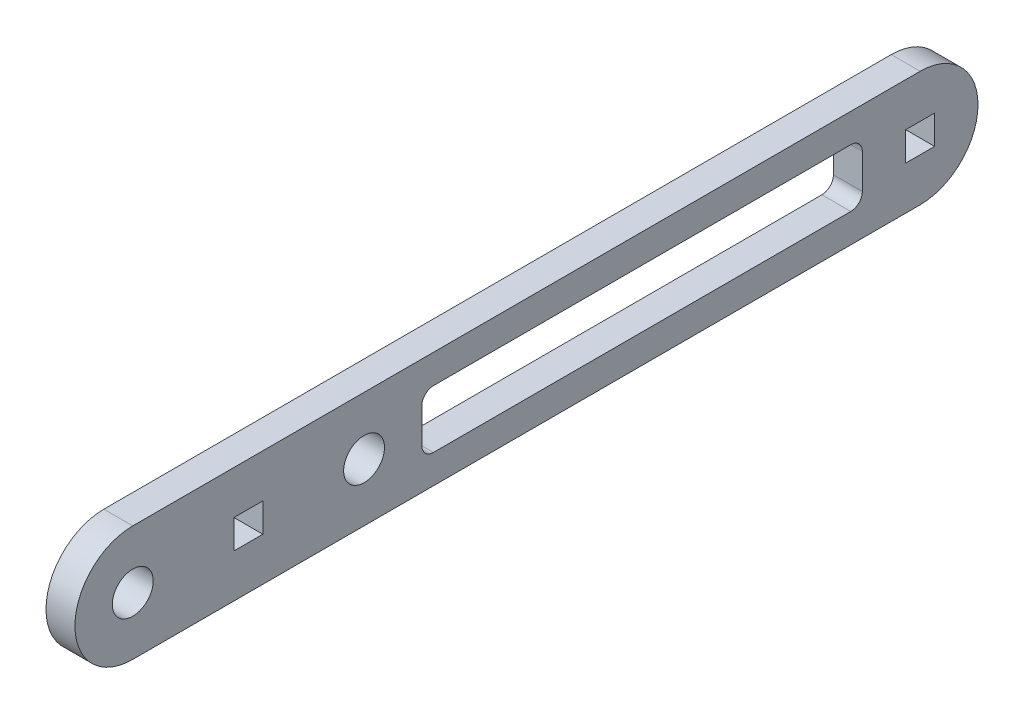
ISO-10303-21;
HEADER;
FILE_DESCRIPTION(('STEP AP214'),'2;1');
FILE_NAME('part.step','',(''),(''),'','','');
FILE_SCHEMA(('AUTOMOTIVE_DESIGN { 1 0 10303 214 1 1 1 1 }'));
ENDSEC;
DATA;
#1=APPLICATION_CONTEXT('core data for automotive mechanical design processes');
#2=APPLICATION_PROTOCOL_DEFINITION('international standard','automotive_design',2000,#1);
#3=PRODUCT_CONTEXT('',#1,'mechanical');
#4=PRODUCT('Part','Part','',(#3));
#5=PRODUCT_RELATED_PRODUCT_CATEGORY('part','',(#4));
#6=PRODUCT_DEFINITION_FORMATION('','',#4);
#7=PRODUCT_DEFINITION_CONTEXT('part definition',#1,'design');
#8=PRODUCT_DEFINITION('design','',#6,#7);
#9=PRODUCT_DEFINITION_SHAPE('','',#8);
#10=(LENGTH_UNIT() NAMED_UNIT(*) SI_UNIT(.MILLI.,.METRE.));
#11=(NAMED_UNIT(*) PLANE_ANGLE_UNIT() SI_UNIT($,.RADIAN.));
#12=(NAMED_UNIT(*) SI_UNIT($,.STERADIAN.) SOLID_ANGLE_UNIT());
#13=UNCERTAINTY_MEASURE_WITH_UNIT(LENGTH_MEASURE(1.E-05),#10,'distance_accuracy_value','');
#14=(GEOMETRIC_REPRESENTATION_CONTEXT(3) GLOBAL_UNCERTAINTY_ASSIGNED_CONTEXT((#13)) GLOBAL_UNIT_ASSIGNED_CONTEXT((#10,
#11,#12)) REPRESENTATION_CONTEXT('',''));
#15=CARTESIAN_POINT('',(0.,0.,0.));
#16=DIRECTION('',(0.,0.,1.));
#17=DIRECTION('',(1.,0.,0.));
#18=AXIS2_PLACEMENT_3D('',#15,#16,#17);
#19=CARTESIAN_POINT('',(3.175,0.,86.4616));
#20=DIRECTION('',(1.,0.,0.));
#21=DIRECTION('',(0.,0.,-1.));
#22=AXIS2_PLACEMENT_3D('',#19,#20,#21);
#23=PLANE('',#22);
#24=DIRECTION('',(0.,0.,-1.));
#25=VECTOR('',#24,1.);
#26=CARTESIAN_POINT('',(3.175,-3.17500000000001,7.62));
#27=LINE('',#26,#25);
#28=CARTESIAN_POINT('',(3.175,-3.17500000000001,53.4416));
#29=VERTEX_POINT('',#28);
#30=CARTESIAN_POINT('',(3.175,-3.17500000000001,7.62));
#31=VERTEX_POINT('',#30);
#32=EDGE_CURVE('E210',#29,#31,#27,.T.);
#33=ORIENTED_EDGE('',*,*,#32,.F.);
#34=CARTESIAN_POINT('',(3.175,-1.90500000000001,53.4416));
#35=DIRECTION('',(1.,0.,0.));
#36=DIRECTION('',(0.,0.,1.));
#37=AXIS2_PLACEMENT_3D('',#34,#35,#36);
#38=CIRCLE('',#37,1.27);
#39=CARTESIAN_POINT('',(3.175,-1.90500000000001,54.7116));
#40=VERTEX_POINT('',#39);
#41=EDGE_CURVE('E207',#40,#29,#38,.T.);
#42=ORIENTED_EDGE('',*,*,#41,.F.);
#43=DIRECTION('',(0.,-1.,0.));
#44=VECTOR('',#43,1.);
#45=CARTESIAN_POINT('',(3.175,-1.90500000000001,54.7116));
#46=LINE('',#45,#44);
#47=CARTESIAN_POINT('',(3.175,1.905,54.7116));
#48=VERTEX_POINT('',#47);
#49=EDGE_CURVE('E205',#48,#40,#46,.T.);
#50=ORIENTED_EDGE('',*,*,#49,.F.);
#51=CARTESIAN_POINT('',(3.175,1.905,53.4416));
#52=DIRECTION('',(1.,0.,0.));
#53=DIRECTION('',(0.,0.,1.));
#54=AXIS2_PLACEMENT_3D('',#51,#52,#53);
#55=CIRCLE('',#54,1.27);
#56=CARTESIAN_POINT('',(3.175,3.175,53.4416));
#57=VERTEX_POINT('',#56);
#58=EDGE_CURVE('E220',#57,#48,#55,.T.);
#59=ORIENTED_EDGE('',*,*,#58,.F.);
#60=DIRECTION('',(0.,0.,1.));
#61=VECTOR('',#60,1.);
#62=CARTESIAN_POINT('',(3.175,3.175,53.4416));
#63=LINE('',#62,#61);
#64=CARTESIAN_POINT('',(3.175,3.175,7.62));
#65=VERTEX_POINT('',#64);
#66=EDGE_CURVE('E218',#65,#57,#63,.T.);
#67=ORIENTED_EDGE('',*,*,#66,.F.);
#68=CARTESIAN_POINT('',(3.175,1.905,7.62));
#69=DIRECTION('',(1.,0.,0.));
#70=DIRECTION('',(0.,0.,1.));
#71=AXIS2_PLACEMENT_3D('',#68,#69,#70);
#72=CIRCLE('',#71,1.27);
#73=CARTESIAN_POINT('',(3.175,1.905,6.35));
#74=VERTEX_POINT('',#73);
#75=EDGE_CURVE('E216',#74,#65,#72,.T.);
#76=ORIENTED_EDGE('',*,*,#75,.F.);
#77=DIRECTION('',(0.,1.,0.));
#78=VECTOR('',#77,1.);
#79=CARTESIAN_POINT('',(3.175,1.905,6.35));
#80=LINE('',#79,#78);
#81=CARTESIAN_POINT('',(3.175,-1.90500000000001,6.35));
#82=VERTEX_POINT('',#81);
#83=EDGE_CURVE('E214',#82,#74,#80,.T.);
#84=ORIENTED_EDGE('',*,*,#83,.F.);
#85=CARTESIAN_POINT('',(3.175,-1.90500000000001,7.62));
#86=DIRECTION('',(1.,0.,0.));
#87=DIRECTION('',(0.,0.,1.));
#88=AXIS2_PLACEMENT_3D('',#85,#86,#87);
#89=CIRCLE('',#88,1.27);
#90=EDGE_CURVE('E212',#31,#82,#89,.T.);
#91=ORIENTED_EDGE('',*,*,#90,.F.);
#92=EDGE_LOOP('',(#33,#42,#50,#59,#67,#76,#84,#91));
#93=FACE_BOUND('',#92,.T.);
#94=CARTESIAN_POINT('',(3.175,0.,61.0616));
#95=DIRECTION('',(1.,0.,0.));
#96=DIRECTION('',(0.,0.,-1.));
#97=AXIS2_PLACEMENT_3D('',#94,#95,#96);
#98=CIRCLE('',#97,2.2450640302673);
#99=CARTESIAN_POINT('',(3.175,0.,58.8165359697327));
#100=VERTEX_POINT('',#99);
#101=EDGE_CURVE('E268',#100,#100,#98,.T.);
#102=ORIENTED_EDGE('',*,*,#101,.F.);
#103=EDGE_LOOP('',(#102));
#104=FACE_BOUND('',#103,.T.);
#105=CARTESIAN_POINT('',(3.175,0.,86.4616));
#106=DIRECTION('',(1.,0.,0.));
#107=DIRECTION('',(0.,0.,-1.));
#108=AXIS2_PLACEMENT_3D('',#105,#106,#107);
#109=CIRCLE('',#108,6.35);
#110=CARTESIAN_POINT('',(3.175,6.35,86.4616));
#111=VERTEX_POINT('',#110);
#112=CARTESIAN_POINT('',(3.175,-6.35,86.4616));
#113=VERTEX_POINT('',#112);
#114=EDGE_CURVE('E305',#111,#113,#109,.T.);
#115=ORIENTED_EDGE('',*,*,#114,.T.);
#116=DIRECTION('',(0.,0.,-1.));
#117=VECTOR('',#116,1.);
#118=CARTESIAN_POINT('',(3.175,-6.35,0.));
#119=LINE('',#118,#117);
#120=CARTESIAN_POINT('',(3.175,-6.35,0.));
#121=VERTEX_POINT('',#120);
#122=EDGE_CURVE('E308',#113,#121,#119,.T.);
#123=ORIENTED_EDGE('',*,*,#122,.T.);
#124=CARTESIAN_POINT('',(3.175,0.,0.));
#125=DIRECTION('',(1.,0.,0.));
#126=DIRECTION('',(0.,0.,1.));
#127=AXIS2_PLACEMENT_3D('',#124,#125,#126);
#128=CIRCLE('',#127,6.35);
#129=CARTESIAN_POINT('',(3.175,6.35,0.));
#130=VERTEX_POINT('',#129);
#131=EDGE_CURVE('E311',#121,#130,#128,.T.);
#132=ORIENTED_EDGE('',*,*,#131,.T.);
#133=DIRECTION('',(0.,0.,1.));
#134=VECTOR('',#133,1.);
#135=CARTESIAN_POINT('',(3.175,6.35,86.4616));
#136=LINE('',#135,#134);
#137=EDGE_CURVE('E313',#130,#111,#136,.T.);
#138=ORIENTED_EDGE('',*,*,#137,.T.);
#139=EDGE_LOOP('',(#115,#123,#132,#138));
#140=FACE_BOUND('',#139,.T.);
#141=DIRECTION('',(0.,0.,-1.));
#142=VECTOR('',#141,1.);
#143=CARTESIAN_POINT('',(3.175,-1.58750000000001,72.1741));
#144=LINE('',#143,#142);
#145=CARTESIAN_POINT('',(3.175,-1.58750000000001,75.3491));
#146=VERTEX_POINT('',#145);
#147=CARTESIAN_POINT('',(3.175,-1.58750000000001,72.1741));
#148=VERTEX_POINT('',#147);
#149=EDGE_CURVE('E276',#146,#148,#144,.T.);
#150=ORIENTED_EDGE('',*,*,#149,.F.);
#151=DIRECTION('',(0.,-1.,0.));
#152=VECTOR('',#151,1.);
#153=CARTESIAN_POINT('',(3.175,-1.58750000000001,75.3491));
#154=LINE('',#153,#152);
#155=CARTESIAN_POINT('',(3.175,1.58749999999999,75.3491));
#156=VERTEX_POINT('',#155);
#157=EDGE_CURVE('E274',#156,#146,#154,.T.);
#158=ORIENTED_EDGE('',*,*,#157,.F.);
#159=DIRECTION('',(0.,0.,1.));
#160=VECTOR('',#159,1.);
#161=CARTESIAN_POINT('',(3.175,1.58749999999999,72.1741));
#162=LINE('',#161,#160);
#163=CARTESIAN_POINT('',(3.175,1.58749999999999,72.1741));
#164=VERTEX_POINT('',#163);
#165=EDGE_CURVE('E282',#164,#156,#162,.T.);
#166=ORIENTED_EDGE('',*,*,#165,.F.);
#167=DIRECTION('',(0.,1.,0.));
#168=VECTOR('',#167,1.);
#169=CARTESIAN_POINT('',(3.175,-1.58750000000001,72.1741));
#170=LINE('',#169,#168);
#171=EDGE_CURVE('E279',#148,#164,#170,.T.);
#172=ORIENTED_EDGE('',*,*,#171,.F.);
#173=EDGE_LOOP('',(#150,#158,#166,#172));
#174=FACE_BOUND('',#173,.T.);
#175=CARTESIAN_POINT('',(3.175,0.,86.4616));
#176=DIRECTION('',(1.,0.,0.));
#177=DIRECTION('',(0.,0.,-1.));
#178=AXIS2_PLACEMENT_3D('',#175,#176,#177);
#179=CIRCLE('',#178,2.2450640302673);
#180=CARTESIAN_POINT('',(3.175,0.,84.2165359697327));
#181=VERTEX_POINT('',#180);
#182=EDGE_CURVE('E262',#181,#181,#179,.T.);
#183=ORIENTED_EDGE('',*,*,#182,.F.);
#184=EDGE_LOOP('',(#183));
#185=FACE_BOUND('',#184,.T.);
#186=DIRECTION('',(0.,0.,-1.));
#187=VECTOR('',#186,1.);
#188=CARTESIAN_POINT('',(3.175,-1.5875,-1.5875));
#189=LINE('',#188,#187);
#190=CARTESIAN_POINT('',(3.175,-1.5875,1.5875));
#191=VERTEX_POINT('',#190);
#192=CARTESIAN_POINT('',(3.175,-1.5875,-1.5875));
#193=VERTEX_POINT('',#192);
#194=EDGE_CURVE('E177',#191,#193,#189,.T.);
#195=ORIENTED_EDGE('',*,*,#194,.F.);
#196=DIRECTION('',(0.,-1.,0.));
#197=VECTOR('',#196,1.);
#198=CARTESIAN_POINT('',(3.175,-1.5875,1.5875));
#199=LINE('',#198,#197);
#200=CARTESIAN_POINT('',(3.175,1.5875,1.5875));
#201=VERTEX_POINT('',#200);
#202=EDGE_CURVE('E169',#201,#191,#199,.T.);
#203=ORIENTED_EDGE('',*,*,#202,.F.);
#204=DIRECTION('',(0.,0.,1.));
#205=VECTOR('',#204,1.);
#206=CARTESIAN_POINT('',(3.175,1.5875,-1.5875));
#207=LINE('',#206,#205);
#208=CARTESIAN_POINT('',(3.175,1.5875,-1.58749999999999));
#209=VERTEX_POINT('',#208);
#210=EDGE_CURVE('E191',#209,#201,#207,.T.);
#211=ORIENTED_EDGE('',*,*,#210,.F.);
#212=DIRECTION('',(0.,1.,0.));
#213=VECTOR('',#212,1.);
#214=CARTESIAN_POINT('',(3.175,-1.5875,-1.5875));
#215=LINE('',#214,#213);
#216=EDGE_CURVE('E189',#193,#209,#215,.T.);
#217=ORIENTED_EDGE('',*,*,#216,.F.);
#218=EDGE_LOOP('',(#195,#203,#211,#217));
#219=FACE_BOUND('',#218,.T.);
#220=ADVANCED_FACE('F32',(#93,#104,#140,#174,#185,#219),#23,.T.);
#221=CARTESIAN_POINT('',(0.,0.,86.4616));
#222=DIRECTION('',(1.,0.,0.));
#223=DIRECTION('',(0.,0.,-1.));
#224=AXIS2_PLACEMENT_3D('',#221,#222,#223);
#225=PLANE('',#224);
#226=CARTESIAN_POINT('',(0.,-1.90500000000001,53.4416));
#227=DIRECTION('',(1.,0.,0.));
#228=DIRECTION('',(0.,0.,1.));
#229=AXIS2_PLACEMENT_3D('',#226,#227,#228);
#230=CIRCLE('',#229,1.27);
#231=CARTESIAN_POINT('',(0.,-1.90500000000001,54.7116));
#232=VERTEX_POINT('',#231);
#233=CARTESIAN_POINT('',(0.,-3.17500000000001,53.4416));
#234=VERTEX_POINT('',#233);
#235=EDGE_CURVE('E185',#232,#234,#230,.T.);
#236=ORIENTED_EDGE('',*,*,#235,.T.);
#237=DIRECTION('',(0.,0.,-1.));
#238=VECTOR('',#237,1.);
#239=CARTESIAN_POINT('',(0.,-3.17500000000001,7.62));
#240=LINE('',#239,#238);
#241=CARTESIAN_POINT('',(0.,-3.17500000000001,7.62));
#242=VERTEX_POINT('',#241);
#243=EDGE_CURVE('E226',#234,#242,#240,.T.);
#244=ORIENTED_EDGE('',*,*,#243,.T.);
#245=CARTESIAN_POINT('',(0.,-1.90500000000001,7.62));
#246=DIRECTION('',(1.,0.,0.));
#247=DIRECTION('',(0.,0.,1.));
#248=AXIS2_PLACEMENT_3D('',#245,#246,#247);
#249=CIRCLE('',#248,1.27);
#250=CARTESIAN_POINT('',(0.,-1.90500000000001,6.35));
#251=VERTEX_POINT('',#250);
#252=EDGE_CURVE('E229',#242,#251,#249,.T.);
#253=ORIENTED_EDGE('',*,*,#252,.T.);
#254=DIRECTION('',(0.,1.,0.));
#255=VECTOR('',#254,1.);
#256=CARTESIAN_POINT('',(0.,1.905,6.35));
#257=LINE('',#256,#255);
#258=CARTESIAN_POINT('',(0.,1.905,6.35));
#259=VERTEX_POINT('',#258);
#260=EDGE_CURVE('E232',#251,#259,#257,.T.);
#261=ORIENTED_EDGE('',*,*,#260,.T.);
#262=CARTESIAN_POINT('',(0.,1.905,7.62));
#263=DIRECTION('',(1.,0.,0.));
#264=DIRECTION('',(0.,0.,1.));
#265=AXIS2_PLACEMENT_3D('',#262,#263,#264);
#266=CIRCLE('',#265,1.27);
#267=CARTESIAN_POINT('',(0.,3.175,7.62));
#268=VERTEX_POINT('',#267);
#269=EDGE_CURVE('E235',#259,#268,#266,.T.);
#270=ORIENTED_EDGE('',*,*,#269,.T.);
#271=DIRECTION('',(0.,0.,1.));
#272=VECTOR('',#271,1.);
#273=CARTESIAN_POINT('',(0.,3.175,53.4416));
#274=LINE('',#273,#272);
#275=CARTESIAN_POINT('',(0.,3.175,53.4416));
#276=VERTEX_POINT('',#275);
#277=EDGE_CURVE('E238',#268,#276,#274,.T.);
#278=ORIENTED_EDGE('',*,*,#277,.T.);
#279=CARTESIAN_POINT('',(0.,1.905,53.4416));
#280=DIRECTION('',(1.,0.,0.));
#281=DIRECTION('',(0.,0.,1.));
#282=AXIS2_PLACEMENT_3D('',#279,#280,#281);
#283=CIRCLE('',#282,1.27);
#284=CARTESIAN_POINT('',(0.,1.905,54.7116));
#285=VERTEX_POINT('',#284);
#286=EDGE_CURVE('E241',#276,#285,#283,.T.);
#287=ORIENTED_EDGE('',*,*,#286,.T.);
#288=DIRECTION('',(0.,-1.,0.));
#289=VECTOR('',#288,1.);
#290=CARTESIAN_POINT('',(0.,0.,54.7116));
#291=LINE('',#290,#289);
#292=EDGE_CURVE('E208',#285,#232,#291,.T.);
#293=ORIENTED_EDGE('',*,*,#292,.T.);
#294=EDGE_LOOP('',(#236,#244,#253,#261,#270,#278,#287,#293));
#295=FACE_BOUND('',#294,.T.);
#296=CARTESIAN_POINT('',(0.,0.,61.0616));
#297=DIRECTION('',(1.,0.,0.));
#298=DIRECTION('',(0.,0.,-1.));
#299=AXIS2_PLACEMENT_3D('',#296,#297,#298);
#300=CIRCLE('',#299,2.2450640302673);
#301=CARTESIAN_POINT('',(0.,0.,58.8165359697327));
#302=VERTEX_POINT('',#301);
#303=EDGE_CURVE('E265',#302,#302,#300,.T.);
#304=ORIENTED_EDGE('',*,*,#303,.T.);
#305=EDGE_LOOP('',(#304));
#306=FACE_BOUND('',#305,.T.);
#307=CARTESIAN_POINT('',(0.,0.,86.4616));
#308=DIRECTION('',(1.,0.,0.));
#309=DIRECTION('',(0.,0.,-1.));
#310=AXIS2_PLACEMENT_3D('',#307,#308,#309);
#311=CIRCLE('',#310,6.35);
#312=CARTESIAN_POINT('',(0.,6.35,86.4616));
#313=VERTEX_POINT('',#312);
#314=CARTESIAN_POINT('',(0.,-6.35,86.4616));
#315=VERTEX_POINT('',#314);
#316=EDGE_CURVE('E304',#313,#315,#311,.T.);
#317=ORIENTED_EDGE('',*,*,#316,.F.);
#318=DIRECTION('',(0.,0.,1.));
#319=VECTOR('',#318,1.);
#320=CARTESIAN_POINT('',(0.,6.35,86.4616));
#321=LINE('',#320,#319);
#322=CARTESIAN_POINT('',(0.,6.35,0.));
#323=VERTEX_POINT('',#322);
#324=EDGE_CURVE('E309',#323,#313,#321,.T.);
#325=ORIENTED_EDGE('',*,*,#324,.F.);
#326=CARTESIAN_POINT('',(0.,0.,0.));
#327=DIRECTION('',(1.,0.,0.));
#328=DIRECTION('',(0.,0.,1.));
#329=AXIS2_PLACEMENT_3D('',#326,#327,#328);
#330=CIRCLE('',#329,6.35);
#331=CARTESIAN_POINT('',(0.,-6.35,0.));
#332=VERTEX_POINT('',#331);
#333=EDGE_CURVE('E320',#332,#323,#330,.T.);
#334=ORIENTED_EDGE('',*,*,#333,.F.);
#335=DIRECTION('',(0.,0.,-1.));
#336=VECTOR('',#335,1.);
#337=CARTESIAN_POINT('',(0.,-6.35,0.));
#338=LINE('',#337,#336);
#339=EDGE_CURVE('E318',#315,#332,#338,.T.);
#340=ORIENTED_EDGE('',*,*,#339,.F.);
#341=EDGE_LOOP('',(#317,#325,#334,#340));
#342=FACE_BOUND('',#341,.T.);
#343=DIRECTION('',(0.,-1.,0.));
#344=VECTOR('',#343,1.);
#345=CARTESIAN_POINT('',(0.,-1.58750000000001,75.3491));
#346=LINE('',#345,#344);
#347=CARTESIAN_POINT('',(0.,1.58749999999999,75.3491));
#348=VERTEX_POINT('',#347);
#349=CARTESIAN_POINT('',(0.,-1.58750000000001,75.3491));
#350=VERTEX_POINT('',#349);
#351=EDGE_CURVE('E271',#348,#350,#346,.T.);
#352=ORIENTED_EDGE('',*,*,#351,.T.);
#353=DIRECTION('',(0.,0.,-1.));
#354=VECTOR('',#353,1.);
#355=CARTESIAN_POINT('',(0.,-1.58750000000001,72.1741));
#356=LINE('',#355,#354);
#357=CARTESIAN_POINT('',(0.,-1.58750000000001,72.1741));
#358=VERTEX_POINT('',#357);
#359=EDGE_CURVE('E287',#350,#358,#356,.T.);
#360=ORIENTED_EDGE('',*,*,#359,.T.);
#361=DIRECTION('',(0.,1.,0.));
#362=VECTOR('',#361,1.);
#363=CARTESIAN_POINT('',(0.,-1.58750000000001,72.1741));
#364=LINE('',#363,#362);
#365=CARTESIAN_POINT('',(0.,1.58749999999999,72.1741));
#366=VERTEX_POINT('',#365);
#367=EDGE_CURVE('E290',#358,#366,#364,.T.);
#368=ORIENTED_EDGE('',*,*,#367,.T.);
#369=DIRECTION('',(0.,0.,1.));
#370=VECTOR('',#369,1.);
#371=CARTESIAN_POINT('',(0.,1.58749999999999,72.1741));
#372=LINE('',#371,#370);
#373=EDGE_CURVE('E277',#366,#348,#372,.T.);
#374=ORIENTED_EDGE('',*,*,#373,.T.);
#375=EDGE_LOOP('',(#352,#360,#368,#374));
#376=FACE_BOUND('',#375,.T.);
#377=CARTESIAN_POINT('',(0.,0.,86.4616));
#378=DIRECTION('',(1.,0.,0.));
#379=DIRECTION('',(0.,0.,-1.));
#380=AXIS2_PLACEMENT_3D('',#377,#378,#379);
#381=CIRCLE('',#380,2.2450640302673);
#382=CARTESIAN_POINT('',(0.,0.,84.2165359697327));
#383=VERTEX_POINT('',#382);
#384=EDGE_CURVE('E261',#383,#383,#381,.T.);
#385=ORIENTED_EDGE('',*,*,#384,.T.);
#386=EDGE_LOOP('',(#385));
#387=FACE_BOUND('',#386,.T.);
#388=DIRECTION('',(0.,-1.,0.));
#389=VECTOR('',#388,1.);
#390=CARTESIAN_POINT('',(0.,-1.5875,1.5875));
#391=LINE('',#390,#389);
#392=CARTESIAN_POINT('',(0.,1.5875,1.58749999999999));
#393=VERTEX_POINT('',#392);
#394=CARTESIAN_POINT('',(0.,-1.5875,1.5875));
#395=VERTEX_POINT('',#394);
#396=EDGE_CURVE('E55',#393,#395,#391,.T.);
#397=ORIENTED_EDGE('',*,*,#396,.T.);
#398=DIRECTION('',(0.,0.,-1.));
#399=VECTOR('',#398,1.);
#400=CARTESIAN_POINT('',(0.,-1.5875,-1.5875));
#401=LINE('',#400,#399);
#402=CARTESIAN_POINT('',(0.,-1.5875,-1.5875));
#403=VERTEX_POINT('',#402);
#404=EDGE_CURVE('E184',#395,#403,#401,.T.);
#405=ORIENTED_EDGE('',*,*,#404,.T.);
#406=DIRECTION('',(0.,1.,0.));
#407=VECTOR('',#406,1.);
#408=CARTESIAN_POINT('',(0.,-1.5875,-1.5875));
#409=LINE('',#408,#407);
#410=CARTESIAN_POINT('',(0.,1.5875,-1.5875));
#411=VERTEX_POINT('',#410);
#412=EDGE_CURVE('E197',#403,#411,#409,.T.);
#413=ORIENTED_EDGE('',*,*,#412,.T.);
#414=DIRECTION('',(0.,0.,1.));
#415=VECTOR('',#414,1.);
#416=CARTESIAN_POINT('',(0.,1.5875,-1.5875));
#417=LINE('',#416,#415);
#418=EDGE_CURVE('E178',#411,#393,#417,.T.);
#419=ORIENTED_EDGE('',*,*,#418,.T.);
#420=EDGE_LOOP('',(#397,#405,#413,#419));
#421=FACE_BOUND('',#420,.T.);
#422=ADVANCED_FACE('F338',(#295,#306,#342,#376,#387,#421),#225,.F.);
#423=CARTESIAN_POINT('',(3.175,0.,86.4616));
#424=DIRECTION('',(-1.,0.,0.));
#425=DIRECTION('',(0.,0.,1.));
#426=AXIS2_PLACEMENT_3D('',#423,#424,#425);
#427=CYLINDRICAL_SURFACE('',#426,6.35);
#428=ORIENTED_EDGE('',*,*,#316,.T.);
#429=DIRECTION('',(-1.,0.,0.));
#430=VECTOR('',#429,1.);
#431=CARTESIAN_POINT('',(3.175,-6.35,86.4616));
#432=LINE('',#431,#430);
#433=EDGE_CURVE('E11',#113,#315,#432,.T.);
#434=ORIENTED_EDGE('',*,*,#433,.F.);
#435=ORIENTED_EDGE('',*,*,#114,.F.);
#436=DIRECTION('',(-1.,0.,0.));
#437=VECTOR('',#436,1.);
#438=CARTESIAN_POINT('',(3.175,6.35,86.4616));
#439=LINE('',#438,#437);
#440=EDGE_CURVE('E315',#111,#313,#439,.T.);
#441=ORIENTED_EDGE('',*,*,#440,.T.);
#442=EDGE_LOOP('',(#428,#434,#435,#441));
#443=FACE_BOUND('',#442,.T.);
#444=ADVANCED_FACE('F34',(#443),#427,.T.);
#445=CARTESIAN_POINT('',(3.175,-6.35,0.));
#446=DIRECTION('',(0.,1.,0.));
#447=DIRECTION('',(0.,0.,1.));
#448=AXIS2_PLACEMENT_3D('',#445,#446,#447);
#449=PLANE('',#448);
#450=ORIENTED_EDGE('',*,*,#339,.T.);
#451=DIRECTION('',(-1.,0.,0.));
#452=VECTOR('',#451,1.);
#453=CARTESIAN_POINT('',(3.175,-6.35,0.));
#454=LINE('',#453,#452);
#455=EDGE_CURVE('E40',#121,#332,#454,.T.);
#456=ORIENTED_EDGE('',*,*,#455,.F.);
#457=ORIENTED_EDGE('',*,*,#122,.F.);
#458=ORIENTED_EDGE('',*,*,#433,.T.);
#459=EDGE_LOOP('',(#450,#456,#457,#458));
#460=FACE_BOUND('',#459,.T.);
#461=ADVANCED_FACE('F349',(#460),#449,.F.);
#462=CARTESIAN_POINT('',(3.175,0.,0.));
#463=DIRECTION('',(-1.,0.,0.));
#464=DIRECTION('',(0.,0.,1.));
#465=AXIS2_PLACEMENT_3D('',#462,#463,#464);
#466=CYLINDRICAL_SURFACE('',#465,6.35);
#467=ORIENTED_EDGE('',*,*,#333,.T.);
#468=DIRECTION('',(-1.,0.,0.));
#469=VECTOR('',#468,1.);
#470=CARTESIAN_POINT('',(3.175,6.35,0.));
#471=LINE('',#470,#469);
#472=EDGE_CURVE('E325',#130,#323,#471,.T.);
#473=ORIENTED_EDGE('',*,*,#472,.F.);
#474=ORIENTED_EDGE('',*,*,#131,.F.);
#475=ORIENTED_EDGE('',*,*,#455,.T.);
#476=EDGE_LOOP('',(#467,#473,#474,#475));
#477=FACE_BOUND('',#476,.T.);
#478=ADVANCED_FACE('F332',(#477),#466,.T.);
#479=CARTESIAN_POINT('',(3.175,6.35,86.4616));
#480=DIRECTION('',(0.,-1.,0.));
#481=DIRECTION('',(0.,0.,-1.));
#482=AXIS2_PLACEMENT_3D('',#479,#480,#481);
#483=PLANE('',#482);
#484=ORIENTED_EDGE('',*,*,#324,.T.);
#485=ORIENTED_EDGE('',*,*,#440,.F.);
#486=ORIENTED_EDGE('',*,*,#137,.F.);
#487=ORIENTED_EDGE('',*,*,#472,.T.);
#488=EDGE_LOOP('',(#484,#485,#486,#487));
#489=FACE_BOUND('',#488,.T.);
#490=ADVANCED_FACE('F342',(#489),#483,.F.);
#491=CARTESIAN_POINT('',(3.175,-1.58750000000001,75.3491));
#492=DIRECTION('',(0.,0.,-1.));
#493=DIRECTION('',(-1.,0.,0.));
#494=AXIS2_PLACEMENT_3D('',#491,#492,#493);
#495=PLANE('',#494);
#496=ORIENTED_EDGE('',*,*,#351,.F.);
#497=DIRECTION('',(-1.,0.,0.));
#498=VECTOR('',#497,1.);
#499=CARTESIAN_POINT('',(3.175,1.58749999999999,75.3491));
#500=LINE('',#499,#498);
#501=EDGE_CURVE('E284',#156,#348,#500,.T.);
#502=ORIENTED_EDGE('',*,*,#501,.F.);
#503=ORIENTED_EDGE('',*,*,#157,.T.);
#504=DIRECTION('',(-1.,0.,0.));
#505=VECTOR('',#504,1.);
#506=CARTESIAN_POINT('',(3.175,-1.58750000000001,75.3491));
#507=LINE('',#506,#505);
#508=EDGE_CURVE('E301',#146,#350,#507,.T.);
#509=ORIENTED_EDGE('',*,*,#508,.T.);
#510=EDGE_LOOP('',(#496,#502,#503,#509));
#511=FACE_BOUND('',#510,.T.);
#512=ADVANCED_FACE('F367',(#511),#495,.T.);
#513=CARTESIAN_POINT('',(3.175,-1.58750000000001,72.1741));
#514=DIRECTION('',(0.,1.,0.));
#515=DIRECTION('',(0.,0.,1.));
#516=AXIS2_PLACEMENT_3D('',#513,#514,#515);
#517=PLANE('',#516);
#518=ORIENTED_EDGE('',*,*,#359,.F.);
#519=ORIENTED_EDGE('',*,*,#508,.F.);
#520=ORIENTED_EDGE('',*,*,#149,.T.);
#521=DIRECTION('',(-1.,0.,0.));
#522=VECTOR('',#521,1.);
#523=CARTESIAN_POINT('',(3.175,-1.58750000000001,72.1741));
#524=LINE('',#523,#522);
#525=EDGE_CURVE('E299',#148,#358,#524,.T.);
#526=ORIENTED_EDGE('',*,*,#525,.T.);
#527=EDGE_LOOP('',(#518,#519,#520,#526));
#528=FACE_BOUND('',#527,.T.);
#529=ADVANCED_FACE('F374',(#528),#517,.T.);
#530=CARTESIAN_POINT('',(3.175,-1.58750000000001,72.1741));
#531=DIRECTION('',(0.,0.,1.));
#532=DIRECTION('',(1.,0.,0.));
#533=AXIS2_PLACEMENT_3D('',#530,#531,#532);
#534=PLANE('',#533);
#535=ORIENTED_EDGE('',*,*,#367,.F.);
#536=ORIENTED_EDGE('',*,*,#525,.F.);
#537=ORIENTED_EDGE('',*,*,#171,.T.);
#538=DIRECTION('',(-1.,0.,0.));
#539=VECTOR('',#538,1.);
#540=CARTESIAN_POINT('',(3.175,1.58749999999999,72.1741));
#541=LINE('',#540,#539);
#542=EDGE_CURVE('E297',#164,#366,#541,.T.);
#543=ORIENTED_EDGE('',*,*,#542,.T.);
#544=EDGE_LOOP('',(#535,#536,#537,#543));
#545=FACE_BOUND('',#544,.T.);
#546=ADVANCED_FACE('F379',(#545),#534,.T.);
#547=CARTESIAN_POINT('',(3.175,1.58749999999999,72.1741));
#548=DIRECTION('',(0.,-1.,0.));
#549=DIRECTION('',(0.,0.,-1.));
#550=AXIS2_PLACEMENT_3D('',#547,#548,#549);
#551=PLANE('',#550);
#552=ORIENTED_EDGE('',*,*,#373,.F.);
#553=ORIENTED_EDGE('',*,*,#542,.F.);
#554=ORIENTED_EDGE('',*,*,#165,.T.);
#555=ORIENTED_EDGE('',*,*,#501,.T.);
#556=EDGE_LOOP('',(#552,#553,#554,#555));
#557=FACE_BOUND('',#556,.T.);
#558=ADVANCED_FACE('F386',(#557),#551,.T.);
#559=CARTESIAN_POINT('',(3.175,0.,61.0616));
#560=DIRECTION('',(-1.,0.,0.));
#561=DIRECTION('',(0.,0.,1.));
#562=AXIS2_PLACEMENT_3D('',#559,#560,#561);
#563=CYLINDRICAL_SURFACE('',#562,2.2450640302673);
#564=ORIENTED_EDGE('',*,*,#101,.T.);
#565=EDGE_LOOP('',(#564));
#566=FACE_BOUND('',#565,.T.);
#567=ORIENTED_EDGE('',*,*,#303,.F.);
#568=EDGE_LOOP('',(#567));
#569=FACE_BOUND('',#568,.T.);
#570=ADVANCED_FACE('F401',(#566,#569),#563,.F.);
#571=CARTESIAN_POINT('',(3.175,0.,86.4616));
#572=DIRECTION('',(-1.,0.,0.));
#573=DIRECTION('',(0.,0.,1.));
#574=AXIS2_PLACEMENT_3D('',#571,#572,#573);
#575=CYLINDRICAL_SURFACE('',#574,2.2450640302673);
#576=ORIENTED_EDGE('',*,*,#182,.T.);
#577=EDGE_LOOP('',(#576));
#578=FACE_BOUND('',#577,.T.);
#579=ORIENTED_EDGE('',*,*,#384,.F.);
#580=EDGE_LOOP('',(#579));
#581=FACE_BOUND('',#580,.T.);
#582=ADVANCED_FACE('F397',(#578,#581),#575,.F.);
#583=CARTESIAN_POINT('',(3.175,-1.90500000000001,53.4416));
#584=DIRECTION('',(-1.,0.,0.));
#585=DIRECTION('',(0.,0.,1.));
#586=AXIS2_PLACEMENT_3D('',#583,#584,#585);
#587=CYLINDRICAL_SURFACE('',#586,1.27);
#588=ORIENTED_EDGE('',*,*,#235,.F.);
#589=DIRECTION('',(-1.,0.,0.));
#590=VECTOR('',#589,1.);
#591=CARTESIAN_POINT('',(3.175,-1.90500000000001,54.7116));
#592=LINE('',#591,#590);
#593=EDGE_CURVE('E259',#40,#232,#592,.T.);
#594=ORIENTED_EDGE('',*,*,#593,.F.);
#595=ORIENTED_EDGE('',*,*,#41,.T.);
#596=DIRECTION('',(-1.,0.,0.));
#597=VECTOR('',#596,1.);
#598=CARTESIAN_POINT('',(3.175,-3.17500000000001,53.4416));
#599=LINE('',#598,#597);
#600=EDGE_CURVE('E257',#29,#234,#599,.T.);
#601=ORIENTED_EDGE('',*,*,#600,.T.);
#602=EDGE_LOOP('',(#588,#594,#595,#601));
#603=FACE_BOUND('',#602,.T.);
#604=ADVANCED_FACE('F400',(#603),#587,.F.);
#605=CARTESIAN_POINT('',(3.175,-3.17500000000001,7.62));
#606=DIRECTION('',(0.,1.,0.));
#607=DIRECTION('',(0.,0.,1.));
#608=AXIS2_PLACEMENT_3D('',#605,#606,#607);
#609=PLANE('',#608);
#610=ORIENTED_EDGE('',*,*,#243,.F.);
#611=ORIENTED_EDGE('',*,*,#600,.F.);
#612=ORIENTED_EDGE('',*,*,#32,.T.);
#613=DIRECTION('',(-1.,0.,0.));
#614=VECTOR('',#613,1.);
#615=CARTESIAN_POINT('',(3.175,-3.17500000000001,7.62));
#616=LINE('',#615,#614);
#617=EDGE_CURVE('E255',#31,#242,#616,.T.);
#618=ORIENTED_EDGE('',*,*,#617,.T.);
#619=EDGE_LOOP('',(#610,#611,#612,#618));
#620=FACE_BOUND('',#619,.T.);
#621=ADVANCED_FACE('F443',(#620),#609,.T.);
#622=CARTESIAN_POINT('',(3.175,-1.90500000000001,7.62));
#623=DIRECTION('',(-1.,0.,0.));
#624=DIRECTION('',(0.,0.,1.));
#625=AXIS2_PLACEMENT_3D('',#622,#623,#624);
#626=CYLINDRICAL_SURFACE('',#625,1.27);
#627=ORIENTED_EDGE('',*,*,#252,.F.);
#628=ORIENTED_EDGE('',*,*,#617,.F.);
#629=ORIENTED_EDGE('',*,*,#90,.T.);
#630=DIRECTION('',(-1.,0.,0.));
#631=VECTOR('',#630,1.);
#632=CARTESIAN_POINT('',(3.175,-1.90500000000001,6.35));
#633=LINE('',#632,#631);
#634=EDGE_CURVE('E253',#82,#251,#633,.T.);
#635=ORIENTED_EDGE('',*,*,#634,.T.);
#636=EDGE_LOOP('',(#627,#628,#629,#635));
#637=FACE_BOUND('',#636,.T.);
#638=ADVANCED_FACE('F439',(#637),#626,.F.);
#639=CARTESIAN_POINT('',(3.175,1.905,6.35));
#640=DIRECTION('',(0.,0.,1.));
#641=DIRECTION('',(0.,-1.,0.));
#642=AXIS2_PLACEMENT_3D('',#639,#640,#641);
#643=PLANE('',#642);
#644=ORIENTED_EDGE('',*,*,#260,.F.);
#645=ORIENTED_EDGE('',*,*,#634,.F.);
#646=ORIENTED_EDGE('',*,*,#83,.T.);
#647=DIRECTION('',(-1.,0.,0.));
#648=VECTOR('',#647,1.);
#649=CARTESIAN_POINT('',(3.175,1.905,6.35));
#650=LINE('',#649,#648);
#651=EDGE_CURVE('E251',#74,#259,#650,.T.);
#652=ORIENTED_EDGE('',*,*,#651,.T.);
#653=EDGE_LOOP('',(#644,#645,#646,#652));
#654=FACE_BOUND('',#653,.T.);
#655=ADVANCED_FACE('F435',(#654),#643,.T.);
#656=CARTESIAN_POINT('',(3.175,1.905,7.62));
#657=DIRECTION('',(-1.,0.,0.));
#658=DIRECTION('',(0.,0.,1.));
#659=AXIS2_PLACEMENT_3D('',#656,#657,#658);
#660=CYLINDRICAL_SURFACE('',#659,1.27);
#661=ORIENTED_EDGE('',*,*,#269,.F.);
#662=ORIENTED_EDGE('',*,*,#651,.F.);
#663=ORIENTED_EDGE('',*,*,#75,.T.);
#664=DIRECTION('',(-1.,0.,0.));
#665=VECTOR('',#664,1.);
#666=CARTESIAN_POINT('',(3.175,3.175,7.62));
#667=LINE('',#666,#665);
#668=EDGE_CURVE('E249',#65,#268,#667,.T.);
#669=ORIENTED_EDGE('',*,*,#668,.T.);
#670=EDGE_LOOP('',(#661,#662,#663,#669));
#671=FACE_BOUND('',#670,.T.);
#672=ADVANCED_FACE('F431',(#671),#660,.F.);
#673=CARTESIAN_POINT('',(3.175,3.175,53.4416));
#674=DIRECTION('',(0.,-1.,0.));
#675=DIRECTION('',(0.,0.,-1.));
#676=AXIS2_PLACEMENT_3D('',#673,#674,#675);
#677=PLANE('',#676);
#678=ORIENTED_EDGE('',*,*,#277,.F.);
#679=ORIENTED_EDGE('',*,*,#668,.F.);
#680=ORIENTED_EDGE('',*,*,#66,.T.);
#681=DIRECTION('',(-1.,0.,0.));
#682=VECTOR('',#681,1.);
#683=CARTESIAN_POINT('',(3.175,3.175,53.4416));
#684=LINE('',#683,#682);
#685=EDGE_CURVE('E247',#57,#276,#684,.T.);
#686=ORIENTED_EDGE('',*,*,#685,.T.);
#687=EDGE_LOOP('',(#678,#679,#680,#686));
#688=FACE_BOUND('',#687,.T.);
#689=ADVANCED_FACE('F427',(#688),#677,.T.);
#690=CARTESIAN_POINT('',(3.175,1.905,53.4416));
#691=DIRECTION('',(-1.,0.,0.));
#692=DIRECTION('',(0.,0.,1.));
#693=AXIS2_PLACEMENT_3D('',#690,#691,#692);
#694=CYLINDRICAL_SURFACE('',#693,1.27);
#695=ORIENTED_EDGE('',*,*,#286,.F.);
#696=ORIENTED_EDGE('',*,*,#685,.F.);
#697=ORIENTED_EDGE('',*,*,#58,.T.);
#698=DIRECTION('',(-1.,0.,0.));
#699=VECTOR('',#698,1.);
#700=CARTESIAN_POINT('',(3.175,1.905,54.7116));
#701=LINE('',#700,#699);
#702=EDGE_CURVE('E223',#48,#285,#701,.T.);
#703=ORIENTED_EDGE('',*,*,#702,.T.);
#704=EDGE_LOOP('',(#695,#696,#697,#703));
#705=FACE_BOUND('',#704,.T.);
#706=ADVANCED_FACE('F423',(#705),#694,.F.);
#707=CARTESIAN_POINT('',(3.175,0.,54.7116));
#708=DIRECTION('',(0.,0.,-1.));
#709=DIRECTION('',(-1.,0.,0.));
#710=AXIS2_PLACEMENT_3D('',#707,#708,#709);
#711=PLANE('',#710);
#712=ORIENTED_EDGE('',*,*,#292,.F.);
#713=ORIENTED_EDGE('',*,*,#702,.F.);
#714=ORIENTED_EDGE('',*,*,#49,.T.);
#715=ORIENTED_EDGE('',*,*,#593,.T.);
#716=EDGE_LOOP('',(#712,#713,#714,#715));
#717=FACE_BOUND('',#716,.T.);
#718=ADVANCED_FACE('F420',(#717),#711,.T.);
#719=CARTESIAN_POINT('',(3.175,-1.5875,1.5875));
#720=DIRECTION('',(0.,0.,-1.));
#721=DIRECTION('',(-1.,0.,0.));
#722=AXIS2_PLACEMENT_3D('',#719,#720,#721);
#723=PLANE('',#722);
#724=ORIENTED_EDGE('',*,*,#396,.F.);
#725=DIRECTION('',(-1.,0.,0.));
#726=VECTOR('',#725,1.);
#727=CARTESIAN_POINT('',(3.175,1.5875,1.5875));
#728=LINE('',#727,#726);
#729=EDGE_CURVE('E173',#201,#393,#728,.T.);
#730=ORIENTED_EDGE('',*,*,#729,.F.);
#731=ORIENTED_EDGE('',*,*,#202,.T.);
#732=DIRECTION('',(-1.,0.,0.));
#733=VECTOR('',#732,1.);
#734=CARTESIAN_POINT('',(3.175,-1.5875,1.5875));
#735=LINE('',#734,#733);
#736=EDGE_CURVE('E172',#191,#395,#735,.T.);
#737=ORIENTED_EDGE('',*,*,#736,.T.);
#738=EDGE_LOOP('',(#724,#730,#731,#737));
#739=FACE_BOUND('',#738,.T.);
#740=ADVANCED_FACE('F171',(#739),#723,.T.);
#741=CARTESIAN_POINT('',(3.175,-1.5875,-1.5875));
#742=DIRECTION('',(0.,1.,0.));
#743=DIRECTION('',(0.,0.,1.));
#744=AXIS2_PLACEMENT_3D('',#741,#742,#743);
#745=PLANE('',#744);
#746=ORIENTED_EDGE('',*,*,#404,.F.);
#747=ORIENTED_EDGE('',*,*,#736,.F.);
#748=ORIENTED_EDGE('',*,*,#194,.T.);
#749=DIRECTION('',(-1.,0.,0.));
#750=VECTOR('',#749,1.);
#751=CARTESIAN_POINT('',(3.175,-1.5875,-1.5875));
#752=LINE('',#751,#750);
#753=EDGE_CURVE('E186',#193,#403,#752,.T.);
#754=ORIENTED_EDGE('',*,*,#753,.T.);
#755=EDGE_LOOP('',(#746,#747,#748,#754));
#756=FACE_BOUND('',#755,.T.);
#757=ADVANCED_FACE('F181',(#756),#745,.T.);
#758=CARTESIAN_POINT('',(3.175,-1.5875,-1.5875));
#759=DIRECTION('',(0.,0.,1.));
#760=DIRECTION('',(1.,0.,0.));
#761=AXIS2_PLACEMENT_3D('',#758,#759,#760);
#762=PLANE('',#761);
#763=ORIENTED_EDGE('',*,*,#412,.F.);
#764=ORIENTED_EDGE('',*,*,#753,.F.);
#765=ORIENTED_EDGE('',*,*,#216,.T.);
#766=DIRECTION('',(-1.,0.,0.));
#767=VECTOR('',#766,1.);
#768=CARTESIAN_POINT('',(3.175,1.5875,-1.5875));
#769=LINE('',#768,#767);
#770=EDGE_CURVE('E47',#209,#411,#769,.T.);
#771=ORIENTED_EDGE('',*,*,#770,.T.);
#772=EDGE_LOOP('',(#763,#764,#765,#771));
#773=FACE_BOUND('',#772,.T.);
#774=ADVANCED_FACE('F408',(#773),#762,.T.);
#775=CARTESIAN_POINT('',(3.175,1.5875,-1.5875));
#776=DIRECTION('',(0.,-1.,0.));
#777=DIRECTION('',(0.,0.,-1.));
#778=AXIS2_PLACEMENT_3D('',#775,#776,#777);
#779=PLANE('',#778);
#780=ORIENTED_EDGE('',*,*,#418,.F.);
#781=ORIENTED_EDGE('',*,*,#770,.F.);
#782=ORIENTED_EDGE('',*,*,#210,.T.);
#783=ORIENTED_EDGE('',*,*,#729,.T.);
#784=EDGE_LOOP('',(#780,#781,#782,#783));
#785=FACE_BOUND('',#784,.T.);
#786=ADVANCED_FACE('F406',(#785),#779,.T.);
#787=CLOSED_SHELL('',(#220,#422,#444,#461,#478,#490,#512,#529,#546,#558,#570,#582,#604,#621,
#638,#655,#672,#689,#706,#718,#740,#757,#774,#786));
#788=MANIFOLD_SOLID_BREP('B2',#787);
#789=ADVANCED_BREP_SHAPE_REPRESENTATION('',(#18,#788),#14);
#790=SHAPE_DEFINITION_REPRESENTATION(#9,#789);
ENDSEC;
END-ISO-10303-21;
